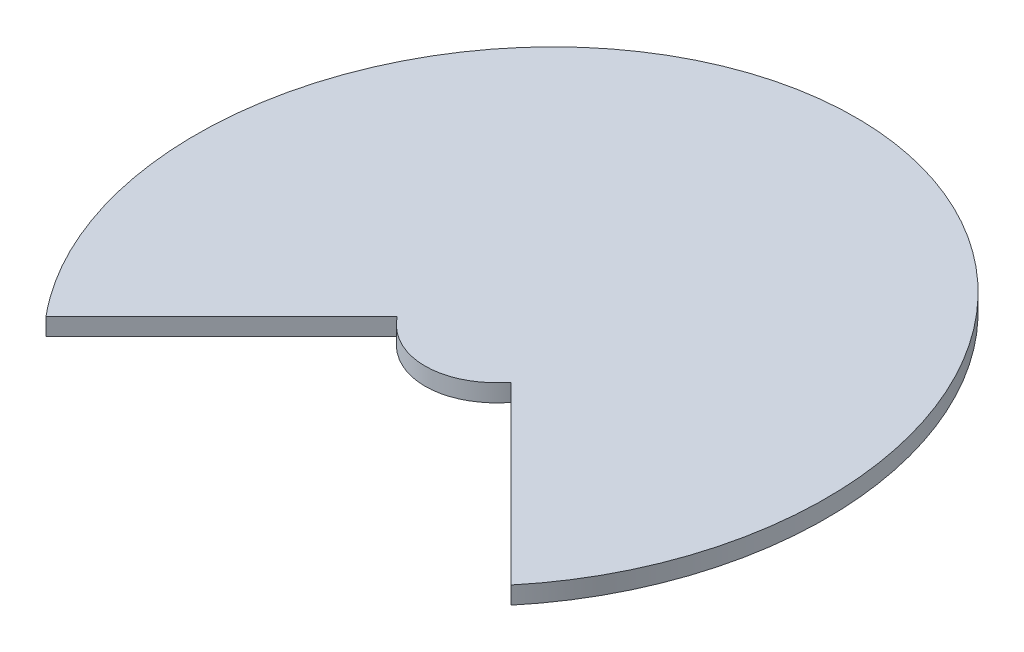
ISO-10303-21;
HEADER;
FILE_DESCRIPTION(('STEP AP214'),'2;1');
FILE_NAME('part.step','',(''),(''),'','','');
FILE_SCHEMA(('AUTOMOTIVE_DESIGN { 1 0 10303 214 1 1 1 1 }'));
ENDSEC;
DATA;
#1=APPLICATION_CONTEXT('core data for automotive mechanical design processes');
#2=APPLICATION_PROTOCOL_DEFINITION('international standard','automotive_design',2000,#1);
#3=PRODUCT_CONTEXT('',#1,'mechanical');
#4=PRODUCT('Part','Part','',(#3));
#5=PRODUCT_RELATED_PRODUCT_CATEGORY('part','',(#4));
#6=PRODUCT_DEFINITION_FORMATION('','',#4);
#7=PRODUCT_DEFINITION_CONTEXT('part definition',#1,'design');
#8=PRODUCT_DEFINITION('design','',#6,#7);
#9=PRODUCT_DEFINITION_SHAPE('','',#8);
#10=(LENGTH_UNIT() NAMED_UNIT(*) SI_UNIT(.MILLI.,.METRE.));
#11=(NAMED_UNIT(*) PLANE_ANGLE_UNIT() SI_UNIT($,.RADIAN.));
#12=(NAMED_UNIT(*) SI_UNIT($,.STERADIAN.) SOLID_ANGLE_UNIT());
#13=UNCERTAINTY_MEASURE_WITH_UNIT(LENGTH_MEASURE(1.E-05),#10,'distance_accuracy_value','');
#14=(GEOMETRIC_REPRESENTATION_CONTEXT(3) GLOBAL_UNCERTAINTY_ASSIGNED_CONTEXT((#13)) GLOBAL_UNIT_ASSIGNED_CONTEXT((#10,
#11,#12)) REPRESENTATION_CONTEXT('',''));
#15=CARTESIAN_POINT('',(0.,0.,0.));
#16=DIRECTION('',(0.,0.,1.));
#17=DIRECTION('',(1.,0.,0.));
#18=AXIS2_PLACEMENT_3D('',#15,#16,#17);
#19=CARTESIAN_POINT('',(-17.7604915978841,6.35,-100.601905284441));
#20=DIRECTION('',(0.,1.,0.));
#21=DIRECTION('',(0.,0.,1.));
#22=AXIS2_PLACEMENT_3D('',#19,#20,#21);
#23=ELLIPSE('',#22,31.2031743508912,27.6098);
#24=DIRECTION('',(0.,-1.,0.));
#25=VECTOR('',#24,1.);
#26=SURFACE_OF_LINEAR_EXTRUSION('',#23,#25);
#27=CARTESIAN_POINT('',(-17.7604915978841,0.,-100.601905284441));
#28=DIRECTION('',(0.,1.,0.));
#29=DIRECTION('',(0.,0.,1.));
#30=AXIS2_PLACEMENT_3D('',#27,#28,#29);
#31=ELLIPSE('',#30,31.2031743508912,27.6098);
#32=CARTESIAN_POINT('',(-38.437837367426,0.,-79.9245595148988));
#33=VERTEX_POINT('',#32);
#34=CARTESIAN_POINT('',(2.91685417165779,0.,-79.9245595148988));
#35=VERTEX_POINT('',#34);
#36=EDGE_CURVE('E114',#33,#35,#31,.T.);
#37=ORIENTED_EDGE('',*,*,#36,.T.);
#38=DIRECTION('',(0.,-1.,0.));
#39=VECTOR('',#38,1.);
#40=CARTESIAN_POINT('',(2.91685417165779,6.35,-79.9245595148988));
#41=LINE('',#40,#39);
#42=CARTESIAN_POINT('',(2.91685417165779,6.35,-79.9245595148988));
#43=VERTEX_POINT('',#42);
#44=EDGE_CURVE('E11',#43,#35,#41,.T.);
#45=ORIENTED_EDGE('',*,*,#44,.F.);
#46=CARTESIAN_POINT('',(-38.437837367426,6.35,-79.9245595148988));
#47=VERTEX_POINT('',#46);
#48=EDGE_CURVE('E88',#47,#43,#23,.T.);
#49=ORIENTED_EDGE('',*,*,#48,.F.);
#50=DIRECTION('',(0.,-1.,0.));
#51=VECTOR('',#50,1.);
#52=CARTESIAN_POINT('',(-38.437837367426,6.35,-79.9245595148988));
#53=LINE('',#52,#51);
#54=EDGE_CURVE('E96',#47,#33,#53,.T.);
#55=ORIENTED_EDGE('',*,*,#54,.T.);
#56=EDGE_LOOP('',(#37,#45,#49,#55));
#57=FACE_BOUND('',#56,.T.);
#58=ADVANCED_FACE('F36',(#57),#26,.F.);
#59=CARTESIAN_POINT('',(2.91685417165779,6.35,-79.9245595148988));
#60=DIRECTION('',(0.707106781186548,0.,-0.707106781186548));
#61=DIRECTION('',(-0.707106781186548,0.,-0.707106781186548));
#62=AXIS2_PLACEMENT_3D('',#59,#60,#61);
#63=PLANE('',#62);
#64=DIRECTION('',(0.707106781186548,0.,0.707106781186548));
#65=VECTOR('',#64,1.);
#66=CARTESIAN_POINT('',(2.91685417165779,0.,-79.9245595148988));
#67=LINE('',#66,#65);
#68=CARTESIAN_POINT('',(66.6158976501024,0.,-16.2255160364542));
#69=VERTEX_POINT('',#68);
#70=EDGE_CURVE('E92',#35,#69,#67,.T.);
#71=ORIENTED_EDGE('',*,*,#70,.T.);
#72=DIRECTION('',(0.,-1.,0.));
#73=VECTOR('',#72,1.);
#74=CARTESIAN_POINT('',(66.6158976501024,6.35,-16.2255160364542));
#75=LINE('',#74,#73);
#76=CARTESIAN_POINT('',(66.6158976501024,6.35,-16.2255160364542));
#77=VERTEX_POINT('',#76);
#78=EDGE_CURVE('E45',#77,#69,#75,.T.);
#79=ORIENTED_EDGE('',*,*,#78,.F.);
#80=DIRECTION('',(0.707106781186548,0.,0.707106781186548));
#81=VECTOR('',#80,1.);
#82=CARTESIAN_POINT('',(2.91685417165779,6.35,-79.9245595148988));
#83=LINE('',#82,#81);
#84=EDGE_CURVE('E83',#43,#77,#83,.T.);
#85=ORIENTED_EDGE('',*,*,#84,.F.);
#86=ORIENTED_EDGE('',*,*,#44,.T.);
#87=EDGE_LOOP('',(#71,#79,#85,#86));
#88=FACE_BOUND('',#87,.T.);
#89=ADVANCED_FACE('F91',(#88),#63,.F.);
#90=CARTESIAN_POINT('',(-17.7604915978841,6.35,-100.601905284441));
#91=DIRECTION('',(0.,1.,0.));
#92=DIRECTION('',(0.,0.,1.));
#93=AXIS2_PLACEMENT_3D('',#90,#91,#92);
#94=ELLIPSE('',#93,125.07976,114.3);
#95=DIRECTION('',(0.,-1.,0.));
#96=VECTOR('',#95,1.);
#97=SURFACE_OF_LINEAR_EXTRUSION('',#94,#96);
#98=CARTESIAN_POINT('',(-17.7604915978841,0.,-100.601905284441));
#99=DIRECTION('',(0.,1.,0.));
#100=DIRECTION('',(0.,0.,1.));
#101=AXIS2_PLACEMENT_3D('',#98,#99,#100);
#102=ELLIPSE('',#101,125.07976,114.3);
#103=CARTESIAN_POINT('',(-102.136880845871,0.,-16.2255160364542));
#104=VERTEX_POINT('',#103);
#105=EDGE_CURVE('E70',#69,#104,#102,.T.);
#106=ORIENTED_EDGE('',*,*,#105,.T.);
#107=DIRECTION('',(0.,-1.,0.));
#108=VECTOR('',#107,1.);
#109=CARTESIAN_POINT('',(-102.136880845871,6.35,-16.2255160364542));
#110=LINE('',#109,#108);
#111=CARTESIAN_POINT('',(-102.136880845871,6.35,-16.2255160364542));
#112=VERTEX_POINT('',#111);
#113=EDGE_CURVE('E93',#112,#104,#110,.T.);
#114=ORIENTED_EDGE('',*,*,#113,.F.);
#115=EDGE_CURVE('E86',#77,#112,#94,.T.);
#116=ORIENTED_EDGE('',*,*,#115,.F.);
#117=ORIENTED_EDGE('',*,*,#78,.T.);
#118=EDGE_LOOP('',(#106,#114,#116,#117));
#119=FACE_BOUND('',#118,.T.);
#120=ADVANCED_FACE('F94',(#119),#97,.F.);
#121=CARTESIAN_POINT('',(-38.437837367426,6.35,-79.9245595148988));
#122=DIRECTION('',(-0.707106781186548,0.,-0.707106781186547));
#123=DIRECTION('',(-0.707106781186547,0.,0.707106781186548));
#124=AXIS2_PLACEMENT_3D('',#121,#122,#123);
#125=PLANE('',#124);
#126=DIRECTION('',(0.707106781186548,0.,-0.707106781186548));
#127=VECTOR('',#126,1.);
#128=CARTESIAN_POINT('',(-38.437837367426,0.,-79.9245595148988));
#129=LINE('',#128,#127);
#130=EDGE_CURVE('E76',#104,#33,#129,.T.);
#131=ORIENTED_EDGE('',*,*,#130,.T.);
#132=ORIENTED_EDGE('',*,*,#54,.F.);
#133=DIRECTION('',(0.707106781186548,0.,-0.707106781186548));
#134=VECTOR('',#133,1.);
#135=CARTESIAN_POINT('',(-38.437837367426,6.35,-79.9245595148988));
#136=LINE('',#135,#134);
#137=EDGE_CURVE('E53',#112,#47,#136,.T.);
#138=ORIENTED_EDGE('',*,*,#137,.F.);
#139=ORIENTED_EDGE('',*,*,#113,.T.);
#140=EDGE_LOOP('',(#131,#132,#138,#139));
#141=FACE_BOUND('',#140,.T.);
#142=ADVANCED_FACE('F103',(#141),#125,.F.);
#143=CARTESIAN_POINT('',(-17.7604915978841,6.35,-100.601905284441));
#144=DIRECTION('',(0.,1.,0.));
#145=DIRECTION('',(0.,0.,1.));
#146=AXIS2_PLACEMENT_3D('',#143,#144,#145);
#147=PLANE('',#146);
#148=ORIENTED_EDGE('',*,*,#48,.T.);
#149=ORIENTED_EDGE('',*,*,#84,.T.);
#150=ORIENTED_EDGE('',*,*,#115,.T.);
#151=ORIENTED_EDGE('',*,*,#137,.T.);
#152=EDGE_LOOP('',(#148,#149,#150,#151));
#153=FACE_BOUND('',#152,.T.);
#154=ADVANCED_FACE('F84',(#153),#147,.T.);
#155=CARTESIAN_POINT('',(-17.7604915978841,0.,-100.601905284441));
#156=DIRECTION('',(0.,1.,0.));
#157=DIRECTION('',(0.,0.,1.));
#158=AXIS2_PLACEMENT_3D('',#155,#156,#157);
#159=PLANE('',#158);
#160=ORIENTED_EDGE('',*,*,#36,.F.);
#161=ORIENTED_EDGE('',*,*,#130,.F.);
#162=ORIENTED_EDGE('',*,*,#105,.F.);
#163=ORIENTED_EDGE('',*,*,#70,.F.);
#164=EDGE_LOOP('',(#160,#161,#162,#163));
#165=FACE_BOUND('',#164,.T.);
#166=ADVANCED_FACE('F121',(#165),#159,.F.);
#167=CLOSED_SHELL('',(#58,#89,#120,#142,#154,#166));
#168=MANIFOLD_SOLID_BREP('B2',#167);
#169=ADVANCED_BREP_SHAPE_REPRESENTATION('',(#18,#168),#14);
#170=SHAPE_DEFINITION_REPRESENTATION(#9,#169);
ENDSEC;
END-ISO-10303-21;
